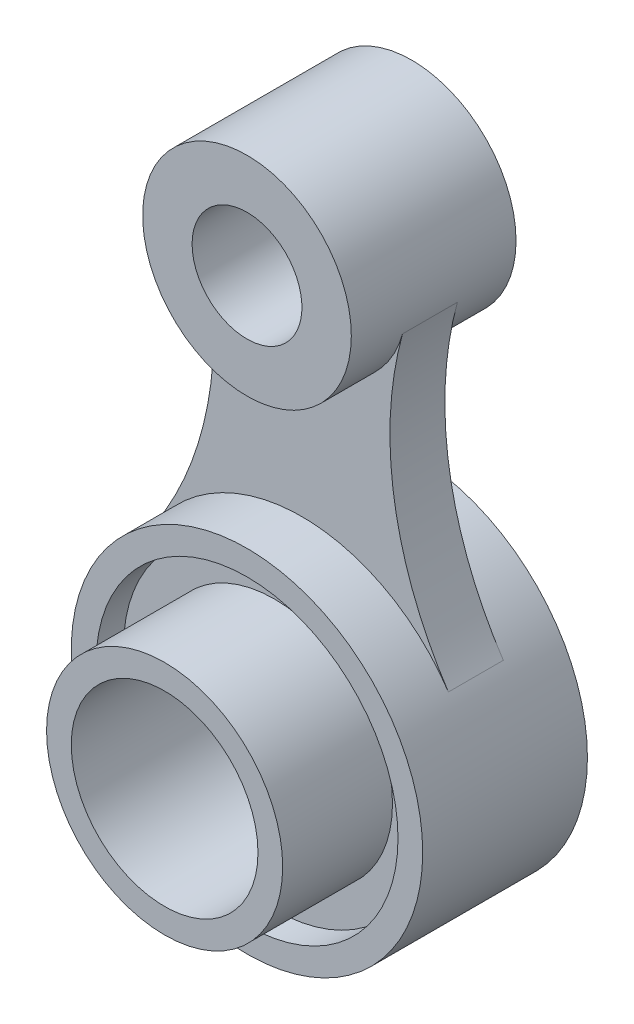
ISO-10303-21;
HEADER;
FILE_DESCRIPTION(('STEP AP214'),'2;1');
FILE_NAME('part.step','',(''),(''),'','','');
FILE_SCHEMA(('AUTOMOTIVE_DESIGN { 1 0 10303 214 1 1 1 1 }'));
ENDSEC;
DATA;
#1=APPLICATION_CONTEXT('core data for automotive mechanical design processes');
#2=APPLICATION_PROTOCOL_DEFINITION('international standard','automotive_design',2000,#1);
#3=PRODUCT_CONTEXT('',#1,'mechanical');
#4=PRODUCT('Part','Part','',(#3));
#5=PRODUCT_RELATED_PRODUCT_CATEGORY('part','',(#4));
#6=PRODUCT_DEFINITION_FORMATION('','',#4);
#7=PRODUCT_DEFINITION_CONTEXT('part definition',#1,'design');
#8=PRODUCT_DEFINITION('design','',#6,#7);
#9=PRODUCT_DEFINITION_SHAPE('','',#8);
#10=(LENGTH_UNIT() NAMED_UNIT(*) SI_UNIT(.MILLI.,.METRE.));
#11=(NAMED_UNIT(*) PLANE_ANGLE_UNIT() SI_UNIT($,.RADIAN.));
#12=(NAMED_UNIT(*) SI_UNIT($,.STERADIAN.) SOLID_ANGLE_UNIT());
#13=UNCERTAINTY_MEASURE_WITH_UNIT(LENGTH_MEASURE(1.E-05),#10,'distance_accuracy_value','');
#14=(GEOMETRIC_REPRESENTATION_CONTEXT(3) GLOBAL_UNCERTAINTY_ASSIGNED_CONTEXT((#13)) GLOBAL_UNIT_ASSIGNED_CONTEXT((#10,
#11,#12)) REPRESENTATION_CONTEXT('',''));
#15=CARTESIAN_POINT('',(0.,0.,0.));
#16=DIRECTION('',(0.,0.,1.));
#17=DIRECTION('',(1.,0.,0.));
#18=AXIS2_PLACEMENT_3D('',#15,#16,#17);
#19=CARTESIAN_POINT('',(0.,37.5,30.));
#20=DIRECTION('',(0.,0.,-1.));
#21=DIRECTION('',(-1.,0.,0.));
#22=AXIS2_PLACEMENT_3D('',#19,#20,#21);
#23=CYLINDRICAL_SURFACE('',#22,19.);
#24=CARTESIAN_POINT('',(0.,37.5,0.));
#25=DIRECTION('',(0.,0.,1.));
#26=DIRECTION('',(1.,0.,0.));
#27=AXIS2_PLACEMENT_3D('',#24,#25,#26);
#28=CIRCLE('',#27,19.);
#29=CARTESIAN_POINT('',(19.,37.5,0.));
#30=VERTEX_POINT('',#29);
#31=EDGE_CURVE('E35',#30,#30,#28,.T.);
#32=ORIENTED_EDGE('',*,*,#31,.T.);
#33=EDGE_LOOP('',(#32));
#34=FACE_BOUND('',#33,.T.);
#35=CARTESIAN_POINT('',(0.,37.5,30.));
#36=DIRECTION('',(0.,0.,1.));
#37=DIRECTION('',(1.,0.,0.));
#38=AXIS2_PLACEMENT_3D('',#35,#36,#37);
#39=CIRCLE('',#38,19.);
#40=CARTESIAN_POINT('',(19.,37.5,30.));
#41=VERTEX_POINT('',#40);
#42=EDGE_CURVE('E11',#41,#41,#39,.T.);
#43=ORIENTED_EDGE('',*,*,#42,.F.);
#44=EDGE_LOOP('',(#43));
#45=FACE_BOUND('',#44,.T.);
#46=CARTESIAN_POINT('',(0.,37.5,20.));
#47=DIRECTION('',(0.,0.,-1.));
#48=DIRECTION('',(1.,0.,0.));
#49=AXIS2_PLACEMENT_3D('',#46,#47,#48);
#50=CIRCLE('',#49,19.);
#51=CARTESIAN_POINT('',(18.3212439861572,32.4669076305221,20.));
#52=VERTEX_POINT('',#51);
#53=CARTESIAN_POINT('',(-18.3212439861572,32.4669076305221,20.));
#54=VERTEX_POINT('',#53);
#55=EDGE_CURVE('E55',#52,#54,#50,.T.);
#56=ORIENTED_EDGE('',*,*,#55,.F.);
#57=DIRECTION('',(0.,0.,-1.));
#58=VECTOR('',#57,1.);
#59=CARTESIAN_POINT('',(18.3212439861572,32.4669076305221,20.));
#60=LINE('',#59,#58);
#61=CARTESIAN_POINT('',(18.3212439861572,32.4669076305221,10.));
#62=VERTEX_POINT('',#61);
#63=EDGE_CURVE('E91',#52,#62,#60,.T.);
#64=ORIENTED_EDGE('',*,*,#63,.T.);
#65=CARTESIAN_POINT('',(0.,37.5,10.));
#66=DIRECTION('',(0.,0.,-1.));
#67=DIRECTION('',(1.,0.,0.));
#68=AXIS2_PLACEMENT_3D('',#65,#66,#67);
#69=CIRCLE('',#68,19.);
#70=CARTESIAN_POINT('',(-18.3212439861572,32.4669076305221,10.));
#71=VERTEX_POINT('',#70);
#72=EDGE_CURVE('E80',#62,#71,#69,.T.);
#73=ORIENTED_EDGE('',*,*,#72,.T.);
#74=DIRECTION('',(0.,0.,-1.));
#75=VECTOR('',#74,1.);
#76=CARTESIAN_POINT('',(-18.3212439861572,32.4669076305221,20.));
#77=LINE('',#76,#75);
#78=EDGE_CURVE('E101',#54,#71,#77,.T.);
#79=ORIENTED_EDGE('',*,*,#78,.F.);
#80=EDGE_LOOP('',(#56,#64,#73,#79));
#81=FACE_BOUND('',#80,.T.);
#82=ADVANCED_FACE('F32',(#34,#45,#81),#23,.T.);
#83=CARTESIAN_POINT('',(0.,37.5,30.));
#84=DIRECTION('',(0.,0.,1.));
#85=DIRECTION('',(1.,0.,0.));
#86=AXIS2_PLACEMENT_3D('',#83,#84,#85);
#87=PLANE('',#86);
#88=CARTESIAN_POINT('',(0.,37.5,30.));
#89=DIRECTION('',(0.,0.,1.));
#90=DIRECTION('',(1.,0.,0.));
#91=AXIS2_PLACEMENT_3D('',#88,#89,#90);
#92=CIRCLE('',#91,10.);
#93=CARTESIAN_POINT('',(-10.,37.5,30.));
#94=VERTEX_POINT('',#93);
#95=EDGE_CURVE('E288',#94,#94,#92,.F.);
#96=ORIENTED_EDGE('',*,*,#95,.T.);
#97=EDGE_LOOP('',(#96));
#98=FACE_BOUND('',#97,.T.);
#99=ORIENTED_EDGE('',*,*,#42,.T.);
#100=EDGE_LOOP('',(#99));
#101=FACE_BOUND('',#100,.T.);
#102=ADVANCED_FACE('F112',(#98,#101),#87,.T.);
#103=CARTESIAN_POINT('',(0.,37.5,0.));
#104=DIRECTION('',(0.,0.,1.));
#105=DIRECTION('',(1.,0.,0.));
#106=AXIS2_PLACEMENT_3D('',#103,#104,#105);
#107=PLANE('',#106);
#108=CARTESIAN_POINT('',(0.,37.5,0.));
#109=DIRECTION('',(0.,0.,1.));
#110=DIRECTION('',(1.,0.,0.));
#111=AXIS2_PLACEMENT_3D('',#108,#109,#110);
#112=CIRCLE('',#111,10.);
#113=CARTESIAN_POINT('',(-10.,37.5,0.));
#114=VERTEX_POINT('',#113);
#115=EDGE_CURVE('E293',#114,#114,#112,.T.);
#116=ORIENTED_EDGE('',*,*,#115,.T.);
#117=EDGE_LOOP('',(#116));
#118=FACE_BOUND('',#117,.T.);
#119=ORIENTED_EDGE('',*,*,#31,.F.);
#120=EDGE_LOOP('',(#119));
#121=FACE_BOUND('',#120,.T.);
#122=ADVANCED_FACE('F109',(#118,#121),#107,.F.);
#123=CARTESIAN_POINT('',(-80.034907939529,15.5133333333333,20.));
#124=DIRECTION('',(0.,0.,-1.));
#125=DIRECTION('',(-1.,0.,0.));
#126=AXIS2_PLACEMENT_3D('',#123,#124,#125);
#127=CYLINDRICAL_SURFACE('',#126,64.);
#128=CARTESIAN_POINT('',(-80.034907939529,15.5133333333333,10.));
#129=DIRECTION('',(0.,0.,-1.));
#130=DIRECTION('',(-1.,0.,0.));
#131=AXIS2_PLACEMENT_3D('',#128,#129,#130);
#132=CIRCLE('',#131,64.);
#133=CARTESIAN_POINT('',(-26.6783026465097,-19.8288888888889,10.));
#134=VERTEX_POINT('',#133);
#135=EDGE_CURVE('E46',#71,#134,#132,.T.);
#136=ORIENTED_EDGE('',*,*,#135,.T.);
#137=DIRECTION('',(0.,0.,-1.));
#138=VECTOR('',#137,1.);
#139=CARTESIAN_POINT('',(-26.6783026465097,-19.8288888888889,20.));
#140=LINE('',#139,#138);
#141=CARTESIAN_POINT('',(-26.6783026465097,-19.8288888888889,20.));
#142=VERTEX_POINT('',#141);
#143=EDGE_CURVE('E90',#142,#134,#140,.T.);
#144=ORIENTED_EDGE('',*,*,#143,.F.);
#145=CARTESIAN_POINT('',(-80.034907939529,15.5133333333333,20.));
#146=DIRECTION('',(0.,0.,-1.));
#147=DIRECTION('',(-1.,0.,0.));
#148=AXIS2_PLACEMENT_3D('',#145,#146,#147);
#149=CIRCLE('',#148,64.);
#150=EDGE_CURVE('E73',#54,#142,#149,.T.);
#151=ORIENTED_EDGE('',*,*,#150,.F.);
#152=ORIENTED_EDGE('',*,*,#78,.T.);
#153=EDGE_LOOP('',(#136,#144,#151,#152));
#154=FACE_BOUND('',#153,.T.);
#155=ADVANCED_FACE('F111',(#154),#127,.F.);
#156=CARTESIAN_POINT('',(80.034907939529,15.5133333333333,20.));
#157=DIRECTION('',(0.,0.,-1.));
#158=DIRECTION('',(-1.,0.,0.));
#159=AXIS2_PLACEMENT_3D('',#156,#157,#158);
#160=CYLINDRICAL_SURFACE('',#159,64.);
#161=CARTESIAN_POINT('',(80.034907939529,15.5133333333333,10.));
#162=DIRECTION('',(0.,0.,-1.));
#163=DIRECTION('',(1.,0.,0.));
#164=AXIS2_PLACEMENT_3D('',#161,#162,#163);
#165=CIRCLE('',#164,64.);
#166=CARTESIAN_POINT('',(26.6783026465097,-19.8288888888889,10.));
#167=VERTEX_POINT('',#166);
#168=EDGE_CURVE('E70',#167,#62,#165,.T.);
#169=ORIENTED_EDGE('',*,*,#168,.T.);
#170=ORIENTED_EDGE('',*,*,#63,.F.);
#171=CARTESIAN_POINT('',(80.034907939529,15.5133333333333,20.));
#172=DIRECTION('',(0.,0.,-1.));
#173=DIRECTION('',(1.,0.,0.));
#174=AXIS2_PLACEMENT_3D('',#171,#172,#173);
#175=CIRCLE('',#174,64.);
#176=CARTESIAN_POINT('',(26.6783026465097,-19.8288888888889,20.));
#177=VERTEX_POINT('',#176);
#178=EDGE_CURVE('E87',#177,#52,#175,.T.);
#179=ORIENTED_EDGE('',*,*,#178,.F.);
#180=DIRECTION('',(0.,0.,-1.));
#181=VECTOR('',#180,1.);
#182=CARTESIAN_POINT('',(26.6783026465097,-19.8288888888889,20.));
#183=LINE('',#182,#181);
#184=EDGE_CURVE('E85',#177,#167,#183,.T.);
#185=ORIENTED_EDGE('',*,*,#184,.T.);
#186=EDGE_LOOP('',(#169,#170,#179,#185));
#187=FACE_BOUND('',#186,.T.);
#188=ADVANCED_FACE('F86',(#187),#160,.F.);
#189=CARTESIAN_POINT('',(-40.0174539697645,-10.9933333333333,20.));
#190=DIRECTION('',(0.,0.,-1.));
#191=DIRECTION('',(-1.,0.,0.));
#192=AXIS2_PLACEMENT_3D('',#189,#190,#191);
#193=PLANE('',#192);
#194=ORIENTED_EDGE('',*,*,#150,.T.);
#195=CARTESIAN_POINT('',(0.,-37.5,20.));
#196=DIRECTION('',(0.,0.,-1.));
#197=DIRECTION('',(1.,0.,0.));
#198=AXIS2_PLACEMENT_3D('',#195,#196,#197);
#199=CIRCLE('',#198,32.);
#200=EDGE_CURVE('E278',#142,#177,#199,.T.);
#201=ORIENTED_EDGE('',*,*,#200,.T.);
#202=ORIENTED_EDGE('',*,*,#178,.T.);
#203=ORIENTED_EDGE('',*,*,#55,.T.);
#204=EDGE_LOOP('',(#194,#201,#202,#203));
#205=FACE_BOUND('',#204,.T.);
#206=ADVANCED_FACE('F207',(#205),#193,.F.);
#207=CARTESIAN_POINT('',(-40.0174539697645,-10.9933333333333,10.));
#208=DIRECTION('',(0.,0.,-1.));
#209=DIRECTION('',(-1.,0.,0.));
#210=AXIS2_PLACEMENT_3D('',#207,#208,#209);
#211=PLANE('',#210);
#212=ORIENTED_EDGE('',*,*,#135,.F.);
#213=ORIENTED_EDGE('',*,*,#72,.F.);
#214=ORIENTED_EDGE('',*,*,#168,.F.);
#215=CARTESIAN_POINT('',(0.,-37.5,10.));
#216=DIRECTION('',(0.,0.,-1.));
#217=DIRECTION('',(1.,0.,0.));
#218=AXIS2_PLACEMENT_3D('',#215,#216,#217);
#219=CIRCLE('',#218,32.);
#220=EDGE_CURVE('E78',#134,#167,#219,.T.);
#221=ORIENTED_EDGE('',*,*,#220,.F.);
#222=EDGE_LOOP('',(#212,#213,#214,#221));
#223=FACE_BOUND('',#222,.T.);
#224=ADVANCED_FACE('F76',(#223),#211,.T.);
#225=CARTESIAN_POINT('',(0.,-37.5,30.));
#226=DIRECTION('',(0.,0.,-1.));
#227=DIRECTION('',(-1.,0.,0.));
#228=AXIS2_PLACEMENT_3D('',#225,#226,#227);
#229=CYLINDRICAL_SURFACE('',#228,32.);
#230=CARTESIAN_POINT('',(0.,-37.5,30.));
#231=DIRECTION('',(0.,0.,1.));
#232=DIRECTION('',(1.,0.,0.));
#233=AXIS2_PLACEMENT_3D('',#230,#231,#232);
#234=CIRCLE('',#233,32.);
#235=CARTESIAN_POINT('',(32.,-37.5,30.));
#236=VERTEX_POINT('',#235);
#237=EDGE_CURVE('E96',#236,#236,#234,.T.);
#238=ORIENTED_EDGE('',*,*,#237,.F.);
#239=EDGE_LOOP('',(#238));
#240=FACE_BOUND('',#239,.T.);
#241=CARTESIAN_POINT('',(0.,-37.5,0.));
#242=DIRECTION('',(0.,0.,1.));
#243=DIRECTION('',(1.,0.,0.));
#244=AXIS2_PLACEMENT_3D('',#241,#242,#243);
#245=CIRCLE('',#244,32.);
#246=CARTESIAN_POINT('',(32.,-37.5,0.));
#247=VERTEX_POINT('',#246);
#248=EDGE_CURVE('E267',#247,#247,#245,.T.);
#249=ORIENTED_EDGE('',*,*,#248,.T.);
#250=EDGE_LOOP('',(#249));
#251=FACE_BOUND('',#250,.T.);
#252=ORIENTED_EDGE('',*,*,#184,.F.);
#253=ORIENTED_EDGE('',*,*,#200,.F.);
#254=ORIENTED_EDGE('',*,*,#143,.T.);
#255=ORIENTED_EDGE('',*,*,#220,.T.);
#256=EDGE_LOOP('',(#252,#253,#254,#255));
#257=FACE_BOUND('',#256,.T.);
#258=ADVANCED_FACE('F94',(#240,#251,#257),#229,.T.);
#259=CARTESIAN_POINT('',(0.,-37.5,30.));
#260=DIRECTION('',(0.,0.,1.));
#261=DIRECTION('',(1.,0.,0.));
#262=AXIS2_PLACEMENT_3D('',#259,#260,#261);
#263=PLANE('',#262);
#264=CARTESIAN_POINT('',(0.,-37.5,30.));
#265=DIRECTION('',(0.,0.,1.));
#266=DIRECTION('',(1.,0.,0.));
#267=AXIS2_PLACEMENT_3D('',#264,#265,#266);
#268=CIRCLE('',#267,27.5);
#269=CARTESIAN_POINT('',(27.5,-37.5,30.));
#270=VERTEX_POINT('',#269);
#271=EDGE_CURVE('E269',#270,#270,#268,.T.);
#272=ORIENTED_EDGE('',*,*,#271,.F.);
#273=EDGE_LOOP('',(#272));
#274=FACE_BOUND('',#273,.T.);
#275=ORIENTED_EDGE('',*,*,#237,.T.);
#276=EDGE_LOOP('',(#275));
#277=FACE_BOUND('',#276,.T.);
#278=ADVANCED_FACE('F152',(#274,#277),#263,.T.);
#279=CARTESIAN_POINT('',(0.,-37.5,0.));
#280=DIRECTION('',(0.,0.,1.));
#281=DIRECTION('',(1.,0.,0.));
#282=AXIS2_PLACEMENT_3D('',#279,#280,#281);
#283=PLANE('',#282);
#284=CARTESIAN_POINT('',(0.,-37.5,0.));
#285=DIRECTION('',(0.,0.,1.));
#286=DIRECTION('',(1.,0.,0.));
#287=AXIS2_PLACEMENT_3D('',#284,#285,#286);
#288=CIRCLE('',#287,17.);
#289=CARTESIAN_POINT('',(-17.,-37.5,0.));
#290=VERTEX_POINT('',#289);
#291=EDGE_CURVE('E294',#290,#290,#288,.T.);
#292=ORIENTED_EDGE('',*,*,#291,.T.);
#293=EDGE_LOOP('',(#292));
#294=FACE_BOUND('',#293,.T.);
#295=ORIENTED_EDGE('',*,*,#248,.F.);
#296=EDGE_LOOP('',(#295));
#297=FACE_BOUND('',#296,.T.);
#298=ADVANCED_FACE('F146',(#294,#297),#283,.F.);
#299=CARTESIAN_POINT('',(0.,-37.5,30.));
#300=DIRECTION('',(0.,0.,-1.));
#301=DIRECTION('',(-1.,0.,0.));
#302=AXIS2_PLACEMENT_3D('',#299,#300,#301);
#303=CYLINDRICAL_SURFACE('',#302,27.5);
#304=ORIENTED_EDGE('',*,*,#271,.T.);
#305=EDGE_LOOP('',(#304));
#306=FACE_BOUND('',#305,.T.);
#307=CARTESIAN_POINT('',(0.,-37.5,25.));
#308=DIRECTION('',(0.,0.,1.));
#309=DIRECTION('',(1.,0.,0.));
#310=AXIS2_PLACEMENT_3D('',#307,#308,#309);
#311=CIRCLE('',#310,27.5);
#312=CARTESIAN_POINT('',(27.5,-37.5,25.));
#313=VERTEX_POINT('',#312);
#314=EDGE_CURVE('E273',#313,#313,#311,.T.);
#315=ORIENTED_EDGE('',*,*,#314,.F.);
#316=EDGE_LOOP('',(#315));
#317=FACE_BOUND('',#316,.T.);
#318=ADVANCED_FACE('F151',(#306,#317),#303,.F.);
#319=CARTESIAN_POINT('',(0.,-37.5,25.));
#320=DIRECTION('',(0.,0.,1.));
#321=DIRECTION('',(1.,0.,0.));
#322=AXIS2_PLACEMENT_3D('',#319,#320,#321);
#323=PLANE('',#322);
#324=CARTESIAN_POINT('',(0.,-37.5,25.));
#325=DIRECTION('',(0.,0.,1.));
#326=DIRECTION('',(1.,0.,0.));
#327=AXIS2_PLACEMENT_3D('',#324,#325,#326);
#328=CIRCLE('',#327,21.5);
#329=CARTESIAN_POINT('',(21.5,-37.5,25.));
#330=VERTEX_POINT('',#329);
#331=EDGE_CURVE('E285',#330,#330,#328,.T.);
#332=ORIENTED_EDGE('',*,*,#331,.F.);
#333=EDGE_LOOP('',(#332));
#334=FACE_BOUND('',#333,.T.);
#335=ORIENTED_EDGE('',*,*,#314,.T.);
#336=EDGE_LOOP('',(#335));
#337=FACE_BOUND('',#336,.T.);
#338=ADVANCED_FACE('F195',(#334,#337),#323,.T.);
#339=CARTESIAN_POINT('',(0.,-37.5,45.));
#340=DIRECTION('',(0.,0.,-1.));
#341=DIRECTION('',(-1.,0.,0.));
#342=AXIS2_PLACEMENT_3D('',#339,#340,#341);
#343=CYLINDRICAL_SURFACE('',#342,21.5);
#344=CARTESIAN_POINT('',(0.,-37.5,45.));
#345=DIRECTION('',(0.,0.,1.));
#346=DIRECTION('',(1.,0.,0.));
#347=AXIS2_PLACEMENT_3D('',#344,#345,#346);
#348=CIRCLE('',#347,21.5);
#349=CARTESIAN_POINT('',(21.5,-37.5,45.));
#350=VERTEX_POINT('',#349);
#351=EDGE_CURVE('E283',#350,#350,#348,.T.);
#352=ORIENTED_EDGE('',*,*,#351,.F.);
#353=EDGE_LOOP('',(#352));
#354=FACE_BOUND('',#353,.T.);
#355=ORIENTED_EDGE('',*,*,#331,.T.);
#356=EDGE_LOOP('',(#355));
#357=FACE_BOUND('',#356,.T.);
#358=ADVANCED_FACE('F137',(#354,#357),#343,.T.);
#359=CARTESIAN_POINT('',(0.,-37.5,45.));
#360=DIRECTION('',(0.,0.,1.));
#361=DIRECTION('',(1.,0.,0.));
#362=AXIS2_PLACEMENT_3D('',#359,#360,#361);
#363=PLANE('',#362);
#364=CARTESIAN_POINT('',(0.,-37.5,45.));
#365=DIRECTION('',(0.,0.,1.));
#366=DIRECTION('',(1.,0.,0.));
#367=AXIS2_PLACEMENT_3D('',#364,#365,#366);
#368=CIRCLE('',#367,17.);
#369=CARTESIAN_POINT('',(-17.,-37.5,45.));
#370=VERTEX_POINT('',#369);
#371=EDGE_CURVE('E297',#370,#370,#368,.T.);
#372=ORIENTED_EDGE('',*,*,#371,.F.);
#373=EDGE_LOOP('',(#372));
#374=FACE_BOUND('',#373,.T.);
#375=ORIENTED_EDGE('',*,*,#351,.T.);
#376=EDGE_LOOP('',(#375));
#377=FACE_BOUND('',#376,.T.);
#378=ADVANCED_FACE('F162',(#374,#377),#363,.T.);
#379=CARTESIAN_POINT('',(0.,-37.5,45.));
#380=DIRECTION('',(0.,0.,-1.));
#381=DIRECTION('',(-1.,0.,0.));
#382=AXIS2_PLACEMENT_3D('',#379,#380,#381);
#383=CYLINDRICAL_SURFACE('',#382,17.);
#384=CARTESIAN_POINT('',(-17.,-37.5,45.));
#385=CARTESIAN_POINT('',(-17.,-37.5,44.53125));
#386=CARTESIAN_POINT('',(-17.,-37.5,44.0625));
#387=CARTESIAN_POINT('',(-17.,-37.5,43.125));
#388=CARTESIAN_POINT('',(-17.,-37.5,42.65625));
#389=CARTESIAN_POINT('',(-17.,-37.5,41.71875));
#390=CARTESIAN_POINT('',(-17.,-37.5,41.25));
#391=CARTESIAN_POINT('',(-17.,-37.5,40.3125));
#392=CARTESIAN_POINT('',(-17.,-37.5,39.84375));
#393=CARTESIAN_POINT('',(-17.,-37.5,38.90625));
#394=CARTESIAN_POINT('',(-17.,-37.5,38.4375));
#395=CARTESIAN_POINT('',(-17.,-37.5,37.5));
#396=CARTESIAN_POINT('',(-17.,-37.5,37.03125));
#397=CARTESIAN_POINT('',(-17.,-37.5,36.09375));
#398=CARTESIAN_POINT('',(-17.,-37.5,35.625));
#399=CARTESIAN_POINT('',(-17.,-37.5,34.6875));
#400=CARTESIAN_POINT('',(-17.,-37.5,34.21875));
#401=CARTESIAN_POINT('',(-17.,-37.5,33.28125));
#402=CARTESIAN_POINT('',(-17.,-37.5,32.8125));
#403=CARTESIAN_POINT('',(-17.,-37.5,31.875));
#404=CARTESIAN_POINT('',(-17.,-37.5,31.40625));
#405=CARTESIAN_POINT('',(-17.,-37.5,30.46875));
#406=CARTESIAN_POINT('',(-17.,-37.5,30.));
#407=CARTESIAN_POINT('',(-17.,-37.5,29.0625));
#408=CARTESIAN_POINT('',(-17.,-37.5,28.59375));
#409=CARTESIAN_POINT('',(-17.,-37.5,27.65625));
#410=CARTESIAN_POINT('',(-17.,-37.5,27.1875));
#411=CARTESIAN_POINT('',(-17.,-37.5,26.25));
#412=CARTESIAN_POINT('',(-17.,-37.5,25.78125));
#413=CARTESIAN_POINT('',(-17.,-37.5,24.84375));
#414=CARTESIAN_POINT('',(-17.,-37.5,24.375));
#415=CARTESIAN_POINT('',(-17.,-37.5,23.4375));
#416=CARTESIAN_POINT('',(-17.,-37.5,22.96875));
#417=CARTESIAN_POINT('',(-17.,-37.5,22.03125));
#418=CARTESIAN_POINT('',(-17.,-37.5,21.5625));
#419=CARTESIAN_POINT('',(-17.,-37.5,20.625));
#420=CARTESIAN_POINT('',(-17.,-37.5,20.15625));
#421=CARTESIAN_POINT('',(-17.,-37.5,19.21875));
#422=CARTESIAN_POINT('',(-17.,-37.5,18.75));
#423=CARTESIAN_POINT('',(-17.,-37.5,17.8125));
#424=CARTESIAN_POINT('',(-17.,-37.5,17.34375));
#425=CARTESIAN_POINT('',(-17.,-37.5,16.40625));
#426=CARTESIAN_POINT('',(-17.,-37.5,15.9375));
#427=CARTESIAN_POINT('',(-17.,-37.5,15.));
#428=CARTESIAN_POINT('',(-17.,-37.5,14.53125));
#429=CARTESIAN_POINT('',(-17.,-37.5,13.59375));
#430=CARTESIAN_POINT('',(-17.,-37.5,13.125));
#431=CARTESIAN_POINT('',(-17.,-37.5,12.1875));
#432=CARTESIAN_POINT('',(-17.,-37.5,11.71875));
#433=CARTESIAN_POINT('',(-17.,-37.5,10.78125));
#434=CARTESIAN_POINT('',(-17.,-37.5,10.3125));
#435=CARTESIAN_POINT('',(-17.,-37.5,9.37499999999999));
#436=CARTESIAN_POINT('',(-17.,-37.5,8.90624999999999));
#437=CARTESIAN_POINT('',(-17.,-37.5,7.96874999999999));
#438=CARTESIAN_POINT('',(-17.,-37.5,7.5));
#439=CARTESIAN_POINT('',(-17.,-37.5,6.56249999999999));
#440=CARTESIAN_POINT('',(-17.,-37.5,6.09374999999999));
#441=CARTESIAN_POINT('',(-17.,-37.5,5.15624999999999));
#442=CARTESIAN_POINT('',(-17.,-37.5,4.68749999999999));
#443=CARTESIAN_POINT('',(-17.,-37.5,3.74999999999999));
#444=CARTESIAN_POINT('',(-17.,-37.5,3.28124999999999));
#445=CARTESIAN_POINT('',(-17.,-37.5,2.34374999999999));
#446=CARTESIAN_POINT('',(-17.,-37.5,1.87499999999999));
#447=CARTESIAN_POINT('',(-17.,-37.5,0.937499999999992));
#448=CARTESIAN_POINT('',(-17.,-37.5,0.468749999999993));
#449=CARTESIAN_POINT('',(-17.,-37.5,0.));
#450=B_SPLINE_CURVE_WITH_KNOTS('',3,(#384,#385,#386,#387,#388,#389,#390,#391,#392,#393,#394,
#395,#396,#397,#398,#399,#400,#401,#402,#403,#404,#405,#406,#407,#408,#409,#410,#411,#412,#413,
#414,#415,#416,#417,#418,#419,#420,#421,#422,#423,#424,#425,#426,#427,#428,#429,#430,#431,#432,
#433,#434,#435,#436,#437,#438,#439,#440,#441,#442,#443,#444,#445,#446,#447,#448,#449),
.UNSPECIFIED.,.F.,.F.,(4,2,2,2,2,2,2,2,2,2,2,2,2,2,2,2,2,2,2,2,2,2,2,2,2,2,2,2,2,2,2,2,4),(0.,
1.40625,2.8125,4.21874999999999,5.625,7.03125,8.43749999999999,9.84375,11.25,12.65625,14.0625,
15.46875,16.875,18.28125,19.6875,21.09375,22.5,23.90625,25.3125,26.71875,28.125,29.53125,
30.9375,32.34375,33.75,35.15625,36.5625,37.96875,39.375,40.78125,42.1875,43.59375,45.),.UNSPECIFIED.);
#451=EDGE_CURVE('BSEAM167',#370,#290,#450,.T.);
#452=ORIENTED_EDGE('',*,*,#371,.T.);
#453=ORIENTED_EDGE('',*,*,#291,.F.);
#454=ORIENTED_EDGE('',*,*,#451,.T.);
#455=ORIENTED_EDGE('',*,*,#451,.F.);
#456=EDGE_LOOP('',(#452,#454,#453,#455));
#457=FACE_BOUND('',#456,.T.);
#458=ADVANCED_FACE('F167',(#457),#383,.F.);
#459=CARTESIAN_POINT('',(0.,37.5,45.));
#460=DIRECTION('',(0.,0.,-1.));
#461=DIRECTION('',(-1.,0.,0.));
#462=AXIS2_PLACEMENT_3D('',#459,#460,#461);
#463=CYLINDRICAL_SURFACE('',#462,10.);
#464=CARTESIAN_POINT('',(-10.,37.5,30.));
#465=CARTESIAN_POINT('',(-10.,37.5,29.6875));
#466=CARTESIAN_POINT('',(-10.,37.5,29.375));
#467=CARTESIAN_POINT('',(-10.,37.5,28.75));
#468=CARTESIAN_POINT('',(-10.,37.5,28.4375));
#469=CARTESIAN_POINT('',(-10.,37.5,27.8125));
#470=CARTESIAN_POINT('',(-10.,37.5,27.5));
#471=CARTESIAN_POINT('',(-10.,37.5,26.875));
#472=CARTESIAN_POINT('',(-10.,37.5,26.5625));
#473=CARTESIAN_POINT('',(-10.,37.5,25.9375));
#474=CARTESIAN_POINT('',(-10.,37.5,25.625));
#475=CARTESIAN_POINT('',(-10.,37.5,25.));
#476=CARTESIAN_POINT('',(-10.,37.5,24.6875));
#477=CARTESIAN_POINT('',(-10.,37.5,24.0625));
#478=CARTESIAN_POINT('',(-10.,37.5,23.75));
#479=CARTESIAN_POINT('',(-10.,37.5,23.125));
#480=CARTESIAN_POINT('',(-10.,37.5,22.8125));
#481=CARTESIAN_POINT('',(-10.,37.5,22.1875));
#482=CARTESIAN_POINT('',(-10.,37.5,21.875));
#483=CARTESIAN_POINT('',(-10.,37.5,21.25));
#484=CARTESIAN_POINT('',(-10.,37.5,20.9375));
#485=CARTESIAN_POINT('',(-10.,37.5,20.3125));
#486=CARTESIAN_POINT('',(-10.,37.5,20.));
#487=CARTESIAN_POINT('',(-10.,37.5,19.375));
#488=CARTESIAN_POINT('',(-10.,37.5,19.0625));
#489=CARTESIAN_POINT('',(-10.,37.5,18.4375));
#490=CARTESIAN_POINT('',(-10.,37.5,18.125));
#491=CARTESIAN_POINT('',(-10.,37.5,17.5));
#492=CARTESIAN_POINT('',(-10.,37.5,17.1875));
#493=CARTESIAN_POINT('',(-10.,37.5,16.5625));
#494=CARTESIAN_POINT('',(-10.,37.5,16.25));
#495=CARTESIAN_POINT('',(-10.,37.5,15.625));
#496=CARTESIAN_POINT('',(-10.,37.5,15.3125));
#497=CARTESIAN_POINT('',(-10.,37.5,14.6875));
#498=CARTESIAN_POINT('',(-10.,37.5,14.375));
#499=CARTESIAN_POINT('',(-10.,37.5,13.75));
#500=CARTESIAN_POINT('',(-10.,37.5,13.4375));
#501=CARTESIAN_POINT('',(-10.,37.5,12.8125));
#502=CARTESIAN_POINT('',(-10.,37.5,12.5));
#503=CARTESIAN_POINT('',(-10.,37.5,11.875));
#504=CARTESIAN_POINT('',(-10.,37.5,11.5625));
#505=CARTESIAN_POINT('',(-10.,37.5,10.9375));
#506=CARTESIAN_POINT('',(-10.,37.5,10.625));
#507=CARTESIAN_POINT('',(-10.,37.5,9.99999999999999));
#508=CARTESIAN_POINT('',(-10.,37.5,9.68749999999999));
#509=CARTESIAN_POINT('',(-10.,37.5,9.06249999999999));
#510=CARTESIAN_POINT('',(-10.,37.5,8.74999999999999));
#511=CARTESIAN_POINT('',(-10.,37.5,8.12499999999999));
#512=CARTESIAN_POINT('',(-10.,37.5,7.8125));
#513=CARTESIAN_POINT('',(-10.,37.5,7.1875));
#514=CARTESIAN_POINT('',(-10.,37.5,6.87499999999999));
#515=CARTESIAN_POINT('',(-10.,37.5,6.24999999999999));
#516=CARTESIAN_POINT('',(-10.,37.5,5.9375));
#517=CARTESIAN_POINT('',(-10.,37.5,5.3125));
#518=CARTESIAN_POINT('',(-10.,37.5,4.99999999999999));
#519=CARTESIAN_POINT('',(-10.,37.5,4.37499999999999));
#520=CARTESIAN_POINT('',(-10.,37.5,4.06249999999999));
#521=CARTESIAN_POINT('',(-10.,37.5,3.4375));
#522=CARTESIAN_POINT('',(-10.,37.5,3.125));
#523=CARTESIAN_POINT('',(-10.,37.5,2.5));
#524=CARTESIAN_POINT('',(-10.,37.5,2.1875));
#525=CARTESIAN_POINT('',(-10.,37.5,1.56249999999999));
#526=CARTESIAN_POINT('',(-10.,37.5,1.24999999999999));
#527=CARTESIAN_POINT('',(-10.,37.5,0.624999999999994));
#528=CARTESIAN_POINT('',(-10.,37.5,0.312499999999993));
#529=CARTESIAN_POINT('',(-10.,37.5,0.));
#530=B_SPLINE_CURVE_WITH_KNOTS('',3,(#464,#465,#466,#467,#468,#469,#470,#471,#472,#473,#474,
#475,#476,#477,#478,#479,#480,#481,#482,#483,#484,#485,#486,#487,#488,#489,#490,#491,#492,#493,
#494,#495,#496,#497,#498,#499,#500,#501,#502,#503,#504,#505,#506,#507,#508,#509,#510,#511,#512,
#513,#514,#515,#516,#517,#518,#519,#520,#521,#522,#523,#524,#525,#526,#527,#528,#529),
.UNSPECIFIED.,.F.,.F.,(4,2,2,2,2,2,2,2,2,2,2,2,2,2,2,2,2,2,2,2,2,2,2,2,2,2,2,2,2,2,2,2,4),(0.,
0.937500000000001,1.875,2.8125,3.75,4.6875,5.625,6.5625,7.5,8.4375,9.37500000000001,10.3125,
11.25,12.1875,13.125,14.0625,15.,15.9375,16.875,17.8125,18.75,19.6875,20.625,21.5625,22.5,
23.4375,24.375,25.3125,26.25,27.1875,28.125,29.0625,30.),.UNSPECIFIED.);
#531=EDGE_CURVE('BSEAM177',#94,#114,#530,.T.);
#532=ORIENTED_EDGE('',*,*,#95,.F.);
#533=ORIENTED_EDGE('',*,*,#115,.F.);
#534=ORIENTED_EDGE('',*,*,#531,.T.);
#535=ORIENTED_EDGE('',*,*,#531,.F.);
#536=EDGE_LOOP('',(#532,#534,#533,#535));
#537=FACE_BOUND('',#536,.T.);
#538=ADVANCED_FACE('F177',(#537),#463,.F.);
#539=CLOSED_SHELL('',(#82,#102,#122,#155,#188,#206,#224,#258,#278,#298,#318,#338,#358,#378,#458,#538));
#540=MANIFOLD_SOLID_BREP('B2',#539);
#541=ADVANCED_BREP_SHAPE_REPRESENTATION('',(#18,#540),#14);
#542=SHAPE_DEFINITION_REPRESENTATION(#9,#541);
ENDSEC;
END-ISO-10303-21;
